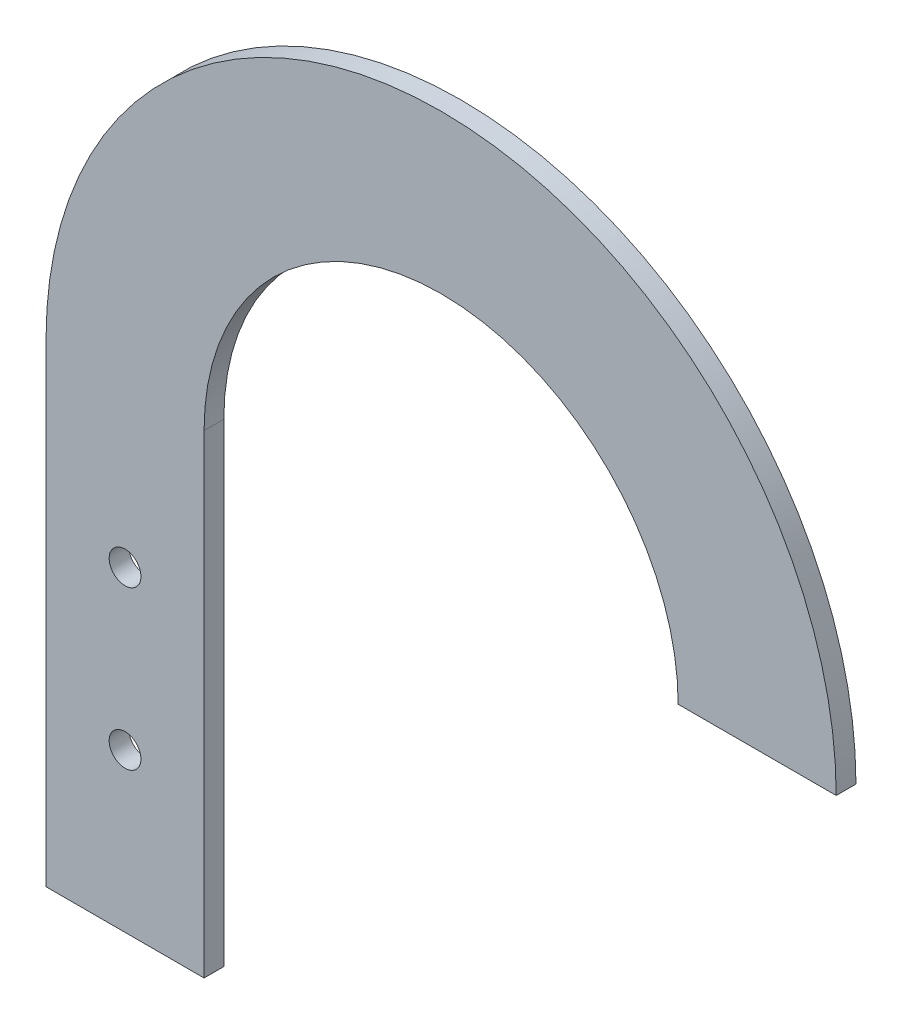
ISO-10303-21;
HEADER;
FILE_DESCRIPTION(('STEP AP214'),'2;1');
FILE_NAME('part.step','',(''),(''),'','','');
FILE_SCHEMA(('AUTOMOTIVE_DESIGN { 1 0 10303 214 1 1 1 1 }'));
ENDSEC;
DATA;
#1=APPLICATION_CONTEXT('core data for automotive mechanical design processes');
#2=APPLICATION_PROTOCOL_DEFINITION('international standard','automotive_design',2000,#1);
#3=PRODUCT_CONTEXT('',#1,'mechanical');
#4=PRODUCT('Part','Part','',(#3));
#5=PRODUCT_RELATED_PRODUCT_CATEGORY('part','',(#4));
#6=PRODUCT_DEFINITION_FORMATION('','',#4);
#7=PRODUCT_DEFINITION_CONTEXT('part definition',#1,'design');
#8=PRODUCT_DEFINITION('design','',#6,#7);
#9=PRODUCT_DEFINITION_SHAPE('','',#8);
#10=(LENGTH_UNIT() NAMED_UNIT(*) SI_UNIT(.MILLI.,.METRE.));
#11=(NAMED_UNIT(*) PLANE_ANGLE_UNIT() SI_UNIT($,.RADIAN.));
#12=(NAMED_UNIT(*) SI_UNIT($,.STERADIAN.) SOLID_ANGLE_UNIT());
#13=UNCERTAINTY_MEASURE_WITH_UNIT(LENGTH_MEASURE(1.E-05),#10,'distance_accuracy_value','');
#14=(GEOMETRIC_REPRESENTATION_CONTEXT(3) GLOBAL_UNCERTAINTY_ASSIGNED_CONTEXT((#13)) GLOBAL_UNIT_ASSIGNED_CONTEXT((#10,
#11,#12)) REPRESENTATION_CONTEXT('',''));
#15=CARTESIAN_POINT('',(0.,0.,0.));
#16=DIRECTION('',(0.,0.,1.));
#17=DIRECTION('',(1.,0.,0.));
#18=AXIS2_PLACEMENT_3D('',#15,#16,#17);
#19=CARTESIAN_POINT('',(63.5,76.2,3.175));
#20=DIRECTION('',(0.,0.,-1.));
#21=DIRECTION('',(-1.,0.,0.));
#22=AXIS2_PLACEMENT_3D('',#19,#20,#21);
#23=PLANE('',#22);
#24=DIRECTION('',(0.,-1.,0.));
#25=VECTOR('',#24,1.);
#26=CARTESIAN_POINT('',(0.,0.,3.175));
#27=LINE('',#26,#25);
#28=CARTESIAN_POINT('',(0.,76.2,3.175));
#29=VERTEX_POINT('',#28);
#30=CARTESIAN_POINT('',(0.,0.,3.175));
#31=VERTEX_POINT('',#30);
#32=EDGE_CURVE('E146',#29,#31,#27,.T.);
#33=ORIENTED_EDGE('',*,*,#32,.T.);
#34=DIRECTION('',(1.,0.,0.));
#35=VECTOR('',#34,1.);
#36=CARTESIAN_POINT('',(0.,0.,3.175));
#37=LINE('',#36,#35);
#38=CARTESIAN_POINT('',(25.4,0.,3.175));
#39=VERTEX_POINT('',#38);
#40=EDGE_CURVE('E94',#31,#39,#37,.T.);
#41=ORIENTED_EDGE('',*,*,#40,.T.);
#42=DIRECTION('',(0.,1.,0.));
#43=VECTOR('',#42,1.);
#44=CARTESIAN_POINT('',(25.4,0.,3.175));
#45=LINE('',#44,#43);
#46=CARTESIAN_POINT('',(25.4,76.2,3.175));
#47=VERTEX_POINT('',#46);
#48=EDGE_CURVE('E107',#39,#47,#45,.T.);
#49=ORIENTED_EDGE('',*,*,#48,.T.);
#50=CARTESIAN_POINT('',(63.5,76.2,3.175));
#51=DIRECTION('',(0.,0.,-1.));
#52=DIRECTION('',(-1.,0.,0.));
#53=AXIS2_PLACEMENT_3D('',#50,#51,#52);
#54=CIRCLE('',#53,38.1);
#55=CARTESIAN_POINT('',(101.6,76.2,3.175));
#56=VERTEX_POINT('',#55);
#57=EDGE_CURVE('E101',#47,#56,#54,.T.);
#58=ORIENTED_EDGE('',*,*,#57,.T.);
#59=DIRECTION('',(1.,0.,0.));
#60=VECTOR('',#59,1.);
#61=CARTESIAN_POINT('',(101.6,76.2,3.175));
#62=LINE('',#61,#60);
#63=CARTESIAN_POINT('',(127.,76.2,3.175));
#64=VERTEX_POINT('',#63);
#65=EDGE_CURVE('E105',#56,#64,#62,.T.);
#66=ORIENTED_EDGE('',*,*,#65,.T.);
#67=CARTESIAN_POINT('',(63.5,76.2,3.175));
#68=DIRECTION('',(0.,0.,1.));
#69=DIRECTION('',(-1.,0.,0.));
#70=AXIS2_PLACEMENT_3D('',#67,#68,#69);
#71=CIRCLE('',#70,63.5);
#72=EDGE_CURVE('E57',#64,#29,#71,.T.);
#73=ORIENTED_EDGE('',*,*,#72,.T.);
#74=EDGE_LOOP('',(#33,#41,#49,#58,#66,#73));
#75=FACE_BOUND('',#74,.T.);
#76=CARTESIAN_POINT('',(12.7,50.8,3.175));
#77=DIRECTION('',(0.,0.,-1.));
#78=DIRECTION('',(-1.,0.,0.));
#79=AXIS2_PLACEMENT_3D('',#76,#77,#78);
#80=CIRCLE('',#79,2.55269999999999);
#81=CARTESIAN_POINT('',(10.1473,50.8,3.175));
#82=VERTEX_POINT('',#81);
#83=EDGE_CURVE('E134',#82,#82,#80,.F.);
#84=ORIENTED_EDGE('',*,*,#83,.F.);
#85=EDGE_LOOP('',(#84));
#86=FACE_BOUND('',#85,.T.);
#87=CARTESIAN_POINT('',(12.7,25.4,3.175));
#88=DIRECTION('',(0.,0.,-1.));
#89=DIRECTION('',(-1.,0.,0.));
#90=AXIS2_PLACEMENT_3D('',#87,#88,#89);
#91=CIRCLE('',#90,2.55269999999999);
#92=CARTESIAN_POINT('',(10.1473,25.4,3.175));
#93=VERTEX_POINT('',#92);
#94=EDGE_CURVE('E192',#93,#93,#91,.F.);
#95=ORIENTED_EDGE('',*,*,#94,.F.);
#96=EDGE_LOOP('',(#95));
#97=FACE_BOUND('',#96,.T.);
#98=ADVANCED_FACE('F39',(#75,#86,#97),#23,.F.);
#99=CARTESIAN_POINT('',(0.,0.,3.175));
#100=DIRECTION('',(1.,0.,0.));
#101=DIRECTION('',(0.,0.,-1.));
#102=AXIS2_PLACEMENT_3D('',#99,#100,#101);
#103=PLANE('',#102);
#104=DIRECTION('',(0.,-1.,0.));
#105=VECTOR('',#104,1.);
#106=CARTESIAN_POINT('',(0.,0.,0.));
#107=LINE('',#106,#105);
#108=CARTESIAN_POINT('',(0.,76.2,0.));
#109=VERTEX_POINT('',#108);
#110=CARTESIAN_POINT('',(0.,0.,0.));
#111=VERTEX_POINT('',#110);
#112=EDGE_CURVE('E129',#109,#111,#107,.T.);
#113=ORIENTED_EDGE('',*,*,#112,.T.);
#114=DIRECTION('',(0.,0.,-1.));
#115=VECTOR('',#114,1.);
#116=CARTESIAN_POINT('',(0.,0.,3.175));
#117=LINE('',#116,#115);
#118=EDGE_CURVE('E11',#31,#111,#117,.T.);
#119=ORIENTED_EDGE('',*,*,#118,.F.);
#120=ORIENTED_EDGE('',*,*,#32,.F.);
#121=DIRECTION('',(0.,0.,-1.));
#122=VECTOR('',#121,1.);
#123=CARTESIAN_POINT('',(0.,76.2,3.175));
#124=LINE('',#123,#122);
#125=EDGE_CURVE('E125',#29,#109,#124,.T.);
#126=ORIENTED_EDGE('',*,*,#125,.T.);
#127=EDGE_LOOP('',(#113,#119,#120,#126));
#128=FACE_BOUND('',#127,.T.);
#129=ADVANCED_FACE('F41',(#128),#103,.F.);
#130=CARTESIAN_POINT('',(0.,0.,3.175));
#131=DIRECTION('',(0.,1.,0.));
#132=DIRECTION('',(0.,0.,1.));
#133=AXIS2_PLACEMENT_3D('',#130,#131,#132);
#134=PLANE('',#133);
#135=DIRECTION('',(1.,0.,0.));
#136=VECTOR('',#135,1.);
#137=CARTESIAN_POINT('',(0.,0.,0.));
#138=LINE('',#137,#136);
#139=CARTESIAN_POINT('',(25.4,0.,0.));
#140=VERTEX_POINT('',#139);
#141=EDGE_CURVE('E133',#111,#140,#138,.T.);
#142=ORIENTED_EDGE('',*,*,#141,.T.);
#143=DIRECTION('',(0.,0.,-1.));
#144=VECTOR('',#143,1.);
#145=CARTESIAN_POINT('',(25.4,0.,3.175));
#146=LINE('',#145,#144);
#147=EDGE_CURVE('E49',#39,#140,#146,.T.);
#148=ORIENTED_EDGE('',*,*,#147,.F.);
#149=ORIENTED_EDGE('',*,*,#40,.F.);
#150=ORIENTED_EDGE('',*,*,#118,.T.);
#151=EDGE_LOOP('',(#142,#148,#149,#150));
#152=FACE_BOUND('',#151,.T.);
#153=ADVANCED_FACE('F179',(#152),#134,.F.);
#154=CARTESIAN_POINT('',(25.4,0.,3.175));
#155=DIRECTION('',(-1.,0.,0.));
#156=DIRECTION('',(0.,0.,1.));
#157=AXIS2_PLACEMENT_3D('',#154,#155,#156);
#158=PLANE('',#157);
#159=DIRECTION('',(0.,1.,0.));
#160=VECTOR('',#159,1.);
#161=CARTESIAN_POINT('',(25.4,0.,0.));
#162=LINE('',#161,#160);
#163=CARTESIAN_POINT('',(25.4,76.2,0.));
#164=VERTEX_POINT('',#163);
#165=EDGE_CURVE('E137',#140,#164,#162,.T.);
#166=ORIENTED_EDGE('',*,*,#165,.T.);
#167=DIRECTION('',(0.,0.,-1.));
#168=VECTOR('',#167,1.);
#169=CARTESIAN_POINT('',(25.4,76.2,3.175));
#170=LINE('',#169,#168);
#171=EDGE_CURVE('E118',#47,#164,#170,.T.);
#172=ORIENTED_EDGE('',*,*,#171,.F.);
#173=ORIENTED_EDGE('',*,*,#48,.F.);
#174=ORIENTED_EDGE('',*,*,#147,.T.);
#175=EDGE_LOOP('',(#166,#172,#173,#174));
#176=FACE_BOUND('',#175,.T.);
#177=ADVANCED_FACE('F156',(#176),#158,.F.);
#178=CARTESIAN_POINT('',(63.5,76.2,3.175));
#179=DIRECTION('',(0.,0.,-1.));
#180=DIRECTION('',(-1.,0.,0.));
#181=AXIS2_PLACEMENT_3D('',#178,#179,#180);
#182=CYLINDRICAL_SURFACE('',#181,38.1);
#183=CARTESIAN_POINT('',(63.5,76.2,0.));
#184=DIRECTION('',(0.,0.,-1.));
#185=DIRECTION('',(-1.,0.,0.));
#186=AXIS2_PLACEMENT_3D('',#183,#184,#185);
#187=CIRCLE('',#186,38.1);
#188=CARTESIAN_POINT('',(101.6,76.2,0.));
#189=VERTEX_POINT('',#188);
#190=EDGE_CURVE('E116',#164,#189,#187,.T.);
#191=ORIENTED_EDGE('',*,*,#190,.T.);
#192=DIRECTION('',(0.,0.,-1.));
#193=VECTOR('',#192,1.);
#194=CARTESIAN_POINT('',(101.6,76.2,3.175));
#195=LINE('',#194,#193);
#196=EDGE_CURVE('E113',#56,#189,#195,.T.);
#197=ORIENTED_EDGE('',*,*,#196,.F.);
#198=ORIENTED_EDGE('',*,*,#57,.F.);
#199=ORIENTED_EDGE('',*,*,#171,.T.);
#200=EDGE_LOOP('',(#191,#197,#198,#199));
#201=FACE_BOUND('',#200,.T.);
#202=ADVANCED_FACE('F114',(#201),#182,.F.);
#203=CARTESIAN_POINT('',(101.6,76.2,3.175));
#204=DIRECTION('',(0.,1.,0.));
#205=DIRECTION('',(0.,0.,1.));
#206=AXIS2_PLACEMENT_3D('',#203,#204,#205);
#207=PLANE('',#206);
#208=DIRECTION('',(1.,0.,0.));
#209=VECTOR('',#208,1.);
#210=CARTESIAN_POINT('',(101.6,76.2,0.));
#211=LINE('',#210,#209);
#212=CARTESIAN_POINT('',(127.,76.2,0.));
#213=VERTEX_POINT('',#212);
#214=EDGE_CURVE('E80',#189,#213,#211,.T.);
#215=ORIENTED_EDGE('',*,*,#214,.T.);
#216=DIRECTION('',(0.,0.,-1.));
#217=VECTOR('',#216,1.);
#218=CARTESIAN_POINT('',(127.,76.2,3.175));
#219=LINE('',#218,#217);
#220=EDGE_CURVE('E119',#64,#213,#219,.T.);
#221=ORIENTED_EDGE('',*,*,#220,.F.);
#222=ORIENTED_EDGE('',*,*,#65,.F.);
#223=ORIENTED_EDGE('',*,*,#196,.T.);
#224=EDGE_LOOP('',(#215,#221,#222,#223));
#225=FACE_BOUND('',#224,.T.);
#226=ADVANCED_FACE('F121',(#225),#207,.F.);
#227=CARTESIAN_POINT('',(63.5,76.2,3.175));
#228=DIRECTION('',(0.,0.,-1.));
#229=DIRECTION('',(-1.,0.,0.));
#230=AXIS2_PLACEMENT_3D('',#227,#228,#229);
#231=CYLINDRICAL_SURFACE('',#230,63.5);
#232=CARTESIAN_POINT('',(63.5,76.2,0.));
#233=DIRECTION('',(0.,0.,1.));
#234=DIRECTION('',(-1.,0.,0.));
#235=AXIS2_PLACEMENT_3D('',#232,#233,#234);
#236=CIRCLE('',#235,63.5);
#237=EDGE_CURVE('E86',#213,#109,#236,.T.);
#238=ORIENTED_EDGE('',*,*,#237,.T.);
#239=ORIENTED_EDGE('',*,*,#125,.F.);
#240=ORIENTED_EDGE('',*,*,#72,.F.);
#241=ORIENTED_EDGE('',*,*,#220,.T.);
#242=EDGE_LOOP('',(#238,#239,#240,#241));
#243=FACE_BOUND('',#242,.T.);
#244=ADVANCED_FACE('F163',(#243),#231,.T.);
#245=CARTESIAN_POINT('',(63.5,76.2,0.));
#246=DIRECTION('',(0.,0.,-1.));
#247=DIRECTION('',(-1.,0.,0.));
#248=AXIS2_PLACEMENT_3D('',#245,#246,#247);
#249=PLANE('',#248);
#250=CARTESIAN_POINT('',(12.7,25.4,0.));
#251=DIRECTION('',(0.,0.,-1.));
#252=DIRECTION('',(-1.,0.,0.));
#253=AXIS2_PLACEMENT_3D('',#250,#251,#252);
#254=CIRCLE('',#253,2.55269999999999);
#255=CARTESIAN_POINT('',(10.1473,25.4,0.));
#256=VERTEX_POINT('',#255);
#257=EDGE_CURVE('E195',#256,#256,#254,.T.);
#258=ORIENTED_EDGE('',*,*,#257,.F.);
#259=EDGE_LOOP('',(#258));
#260=FACE_BOUND('',#259,.T.);
#261=CARTESIAN_POINT('',(12.7,50.8,0.));
#262=DIRECTION('',(0.,0.,-1.));
#263=DIRECTION('',(-1.,0.,0.));
#264=AXIS2_PLACEMENT_3D('',#261,#262,#263);
#265=CIRCLE('',#264,2.55269999999999);
#266=CARTESIAN_POINT('',(10.1473,50.8,0.));
#267=VERTEX_POINT('',#266);
#268=EDGE_CURVE('E199',#267,#267,#265,.T.);
#269=ORIENTED_EDGE('',*,*,#268,.F.);
#270=EDGE_LOOP('',(#269));
#271=FACE_BOUND('',#270,.T.);
#272=ORIENTED_EDGE('',*,*,#112,.F.);
#273=ORIENTED_EDGE('',*,*,#237,.F.);
#274=ORIENTED_EDGE('',*,*,#214,.F.);
#275=ORIENTED_EDGE('',*,*,#190,.F.);
#276=ORIENTED_EDGE('',*,*,#165,.F.);
#277=ORIENTED_EDGE('',*,*,#141,.F.);
#278=EDGE_LOOP('',(#272,#273,#274,#275,#276,#277));
#279=FACE_BOUND('',#278,.T.);
#280=ADVANCED_FACE('F159',(#260,#271,#279),#249,.T.);
#281=CARTESIAN_POINT('',(12.7,50.8,0.));
#282=DIRECTION('',(0.,0.,-1.));
#283=DIRECTION('',(-1.,0.,0.));
#284=AXIS2_PLACEMENT_3D('',#281,#282,#283);
#285=CYLINDRICAL_SURFACE('',#284,2.55269999999999);
#286=ORIENTED_EDGE('',*,*,#83,.T.);
#287=EDGE_LOOP('',(#286));
#288=FACE_BOUND('',#287,.T.);
#289=ORIENTED_EDGE('',*,*,#268,.T.);
#290=EDGE_LOOP('',(#289));
#291=FACE_BOUND('',#290,.T.);
#292=ADVANCED_FACE('F170',(#288,#291),#285,.F.);
#293=CARTESIAN_POINT('',(12.7,25.4,0.));
#294=DIRECTION('',(0.,0.,-1.));
#295=DIRECTION('',(-1.,0.,0.));
#296=AXIS2_PLACEMENT_3D('',#293,#294,#295);
#297=CYLINDRICAL_SURFACE('',#296,2.55269999999999);
#298=ORIENTED_EDGE('',*,*,#94,.T.);
#299=EDGE_LOOP('',(#298));
#300=FACE_BOUND('',#299,.T.);
#301=ORIENTED_EDGE('',*,*,#257,.T.);
#302=EDGE_LOOP('',(#301));
#303=FACE_BOUND('',#302,.T.);
#304=ADVANCED_FACE('F183',(#300,#303),#297,.F.);
#305=CLOSED_SHELL('',(#98,#129,#153,#177,#202,#226,#244,#280,#292,#304));
#306=MANIFOLD_SOLID_BREP('B2',#305);
#307=ADVANCED_BREP_SHAPE_REPRESENTATION('',(#18,#306),#14);
#308=SHAPE_DEFINITION_REPRESENTATION(#9,#307);
ENDSEC;
END-ISO-10303-21;
